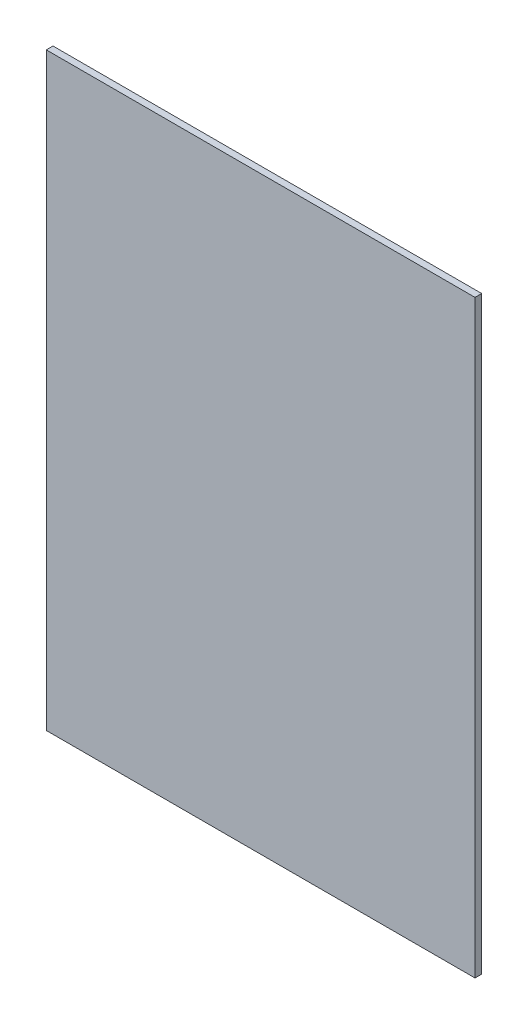
ISO-10303-21;
HEADER;
FILE_DESCRIPTION(('STEP AP214'),'2;1');
FILE_NAME('part.step','',(''),(''),'','','');
FILE_SCHEMA(('AUTOMOTIVE_DESIGN { 1 0 10303 214 1 1 1 1 }'));
ENDSEC;
DATA;
#1=APPLICATION_CONTEXT('core data for automotive mechanical design processes');
#2=APPLICATION_PROTOCOL_DEFINITION('international standard','automotive_design',2000,#1);
#3=PRODUCT_CONTEXT('',#1,'mechanical');
#4=PRODUCT('Part','Part','',(#3));
#5=PRODUCT_RELATED_PRODUCT_CATEGORY('part','',(#4));
#6=PRODUCT_DEFINITION_FORMATION('','',#4);
#7=PRODUCT_DEFINITION_CONTEXT('part definition',#1,'design');
#8=PRODUCT_DEFINITION('design','',#6,#7);
#9=PRODUCT_DEFINITION_SHAPE('','',#8);
#10=(LENGTH_UNIT() NAMED_UNIT(*) SI_UNIT(.MILLI.,.METRE.));
#11=(NAMED_UNIT(*) PLANE_ANGLE_UNIT() SI_UNIT($,.RADIAN.));
#12=(NAMED_UNIT(*) SI_UNIT($,.STERADIAN.) SOLID_ANGLE_UNIT());
#13=UNCERTAINTY_MEASURE_WITH_UNIT(LENGTH_MEASURE(1.E-05),#10,'distance_accuracy_value','');
#14=(GEOMETRIC_REPRESENTATION_CONTEXT(3) GLOBAL_UNCERTAINTY_ASSIGNED_CONTEXT((#13)) GLOBAL_UNIT_ASSIGNED_CONTEXT((#10,
#11,#12)) REPRESENTATION_CONTEXT('',''));
#15=CARTESIAN_POINT('',(0.,0.,0.));
#16=DIRECTION('',(0.,0.,1.));
#17=DIRECTION('',(1.,0.,0.));
#18=AXIS2_PLACEMENT_3D('',#15,#16,#17);
#19=CARTESIAN_POINT('',(0.,279.4,3.175));
#20=DIRECTION('',(0.,1.,0.));
#21=DIRECTION('',(0.,0.,1.));
#22=AXIS2_PLACEMENT_3D('',#19,#20,#21);
#23=PLANE('',#22);
#24=DIRECTION('',(1.,0.,0.));
#25=VECTOR('',#24,1.);
#26=CARTESIAN_POINT('',(0.,279.4,0.));
#27=LINE('',#26,#25);
#28=CARTESIAN_POINT('',(0.,279.4,0.));
#29=VERTEX_POINT('',#28);
#30=CARTESIAN_POINT('',(203.2,279.4,0.));
#31=VERTEX_POINT('',#30);
#32=EDGE_CURVE('E105',#29,#31,#27,.T.);
#33=ORIENTED_EDGE('',*,*,#32,.F.);
#34=DIRECTION('',(0.,0.,-1.));
#35=VECTOR('',#34,1.);
#36=CARTESIAN_POINT('',(0.,279.4,3.175));
#37=LINE('',#36,#35);
#38=CARTESIAN_POINT('',(0.,279.4,3.175));
#39=VERTEX_POINT('',#38);
#40=EDGE_CURVE('E11',#39,#29,#37,.T.);
#41=ORIENTED_EDGE('',*,*,#40,.F.);
#42=DIRECTION('',(1.,0.,0.));
#43=VECTOR('',#42,1.);
#44=CARTESIAN_POINT('',(0.,279.4,3.175));
#45=LINE('',#44,#43);
#46=CARTESIAN_POINT('',(203.2,279.4,3.175));
#47=VERTEX_POINT('',#46);
#48=EDGE_CURVE('E99',#39,#47,#45,.T.);
#49=ORIENTED_EDGE('',*,*,#48,.T.);
#50=DIRECTION('',(0.,0.,-1.));
#51=VECTOR('',#50,1.);
#52=CARTESIAN_POINT('',(203.2,279.4,3.175));
#53=LINE('',#52,#51);
#54=EDGE_CURVE('E44',#47,#31,#53,.T.);
#55=ORIENTED_EDGE('',*,*,#54,.T.);
#56=EDGE_LOOP('',(#33,#41,#49,#55));
#57=FACE_BOUND('',#56,.T.);
#58=ADVANCED_FACE('F41',(#57),#23,.T.);
#59=CARTESIAN_POINT('',(0.,0.,3.175));
#60=DIRECTION('',(-1.,0.,0.));
#61=DIRECTION('',(0.,0.,1.));
#62=AXIS2_PLACEMENT_3D('',#59,#60,#61);
#63=PLANE('',#62);
#64=DIRECTION('',(0.,1.,0.));
#65=VECTOR('',#64,1.);
#66=CARTESIAN_POINT('',(0.,0.,0.));
#67=LINE('',#66,#65);
#68=CARTESIAN_POINT('',(0.,0.,0.));
#69=VERTEX_POINT('',#68);
#70=EDGE_CURVE('E101',#69,#29,#67,.T.);
#71=ORIENTED_EDGE('',*,*,#70,.F.);
#72=DIRECTION('',(0.,0.,-1.));
#73=VECTOR('',#72,1.);
#74=CARTESIAN_POINT('',(0.,0.,3.175));
#75=LINE('',#74,#73);
#76=CARTESIAN_POINT('',(0.,0.,3.175));
#77=VERTEX_POINT('',#76);
#78=EDGE_CURVE('E50',#77,#69,#75,.T.);
#79=ORIENTED_EDGE('',*,*,#78,.F.);
#80=DIRECTION('',(0.,1.,0.));
#81=VECTOR('',#80,1.);
#82=CARTESIAN_POINT('',(0.,0.,3.175));
#83=LINE('',#82,#81);
#84=EDGE_CURVE('E89',#77,#39,#83,.T.);
#85=ORIENTED_EDGE('',*,*,#84,.T.);
#86=ORIENTED_EDGE('',*,*,#40,.T.);
#87=EDGE_LOOP('',(#71,#79,#85,#86));
#88=FACE_BOUND('',#87,.T.);
#89=ADVANCED_FACE('F115',(#88),#63,.T.);
#90=CARTESIAN_POINT('',(0.,0.,3.175));
#91=DIRECTION('',(0.,1.,0.));
#92=DIRECTION('',(0.,0.,1.));
#93=AXIS2_PLACEMENT_3D('',#90,#91,#92);
#94=PLANE('',#93);
#95=DIRECTION('',(1.,0.,0.));
#96=VECTOR('',#95,1.);
#97=CARTESIAN_POINT('',(0.,0.,0.));
#98=LINE('',#97,#96);
#99=CARTESIAN_POINT('',(203.2,0.,0.));
#100=VERTEX_POINT('',#99);
#101=EDGE_CURVE('E94',#69,#100,#98,.T.);
#102=ORIENTED_EDGE('',*,*,#101,.T.);
#103=DIRECTION('',(0.,0.,-1.));
#104=VECTOR('',#103,1.);
#105=CARTESIAN_POINT('',(203.2,0.,3.175));
#106=LINE('',#105,#104);
#107=CARTESIAN_POINT('',(203.2,0.,3.175));
#108=VERTEX_POINT('',#107);
#109=EDGE_CURVE('E92',#108,#100,#106,.T.);
#110=ORIENTED_EDGE('',*,*,#109,.F.);
#111=DIRECTION('',(1.,0.,0.));
#112=VECTOR('',#111,1.);
#113=CARTESIAN_POINT('',(0.,0.,3.175));
#114=LINE('',#113,#112);
#115=EDGE_CURVE('E86',#77,#108,#114,.T.);
#116=ORIENTED_EDGE('',*,*,#115,.F.);
#117=ORIENTED_EDGE('',*,*,#78,.T.);
#118=EDGE_LOOP('',(#102,#110,#116,#117));
#119=FACE_BOUND('',#118,.T.);
#120=ADVANCED_FACE('F93',(#119),#94,.F.);
#121=CARTESIAN_POINT('',(203.2,0.,3.175));
#122=DIRECTION('',(-1.,0.,0.));
#123=DIRECTION('',(0.,0.,1.));
#124=AXIS2_PLACEMENT_3D('',#121,#122,#123);
#125=PLANE('',#124);
#126=DIRECTION('',(0.,1.,0.));
#127=VECTOR('',#126,1.);
#128=CARTESIAN_POINT('',(203.2,0.,0.));
#129=LINE('',#128,#127);
#130=EDGE_CURVE('E108',#100,#31,#129,.T.);
#131=ORIENTED_EDGE('',*,*,#130,.T.);
#132=ORIENTED_EDGE('',*,*,#54,.F.);
#133=DIRECTION('',(0.,1.,0.));
#134=VECTOR('',#133,1.);
#135=CARTESIAN_POINT('',(203.2,0.,3.175));
#136=LINE('',#135,#134);
#137=EDGE_CURVE('E83',#108,#47,#136,.T.);
#138=ORIENTED_EDGE('',*,*,#137,.F.);
#139=ORIENTED_EDGE('',*,*,#109,.T.);
#140=EDGE_LOOP('',(#131,#132,#138,#139));
#141=FACE_BOUND('',#140,.T.);
#142=ADVANCED_FACE('F98',(#141),#125,.F.);
#143=CARTESIAN_POINT('',(0.,0.,3.175));
#144=DIRECTION('',(0.,0.,1.));
#145=DIRECTION('',(1.,0.,0.));
#146=AXIS2_PLACEMENT_3D('',#143,#144,#145);
#147=PLANE('',#146);
#148=ORIENTED_EDGE('',*,*,#48,.F.);
#149=ORIENTED_EDGE('',*,*,#84,.F.);
#150=ORIENTED_EDGE('',*,*,#115,.T.);
#151=ORIENTED_EDGE('',*,*,#137,.T.);
#152=EDGE_LOOP('',(#148,#149,#150,#151));
#153=FACE_BOUND('',#152,.T.);
#154=ADVANCED_FACE('F88',(#153),#147,.T.);
#155=CARTESIAN_POINT('',(0.,0.,0.));
#156=DIRECTION('',(0.,0.,1.));
#157=DIRECTION('',(1.,0.,0.));
#158=AXIS2_PLACEMENT_3D('',#155,#156,#157);
#159=PLANE('',#158);
#160=ORIENTED_EDGE('',*,*,#32,.T.);
#161=ORIENTED_EDGE('',*,*,#130,.F.);
#162=ORIENTED_EDGE('',*,*,#101,.F.);
#163=ORIENTED_EDGE('',*,*,#70,.T.);
#164=EDGE_LOOP('',(#160,#161,#162,#163));
#165=FACE_BOUND('',#164,.T.);
#166=ADVANCED_FACE('F114',(#165),#159,.F.);
#167=CLOSED_SHELL('',(#58,#89,#120,#142,#154,#166));
#168=MANIFOLD_SOLID_BREP('B2',#167);
#169=ADVANCED_BREP_SHAPE_REPRESENTATION('',(#18,#168),#14);
#170=SHAPE_DEFINITION_REPRESENTATION(#9,#169);
ENDSEC;
END-ISO-10303-21;
